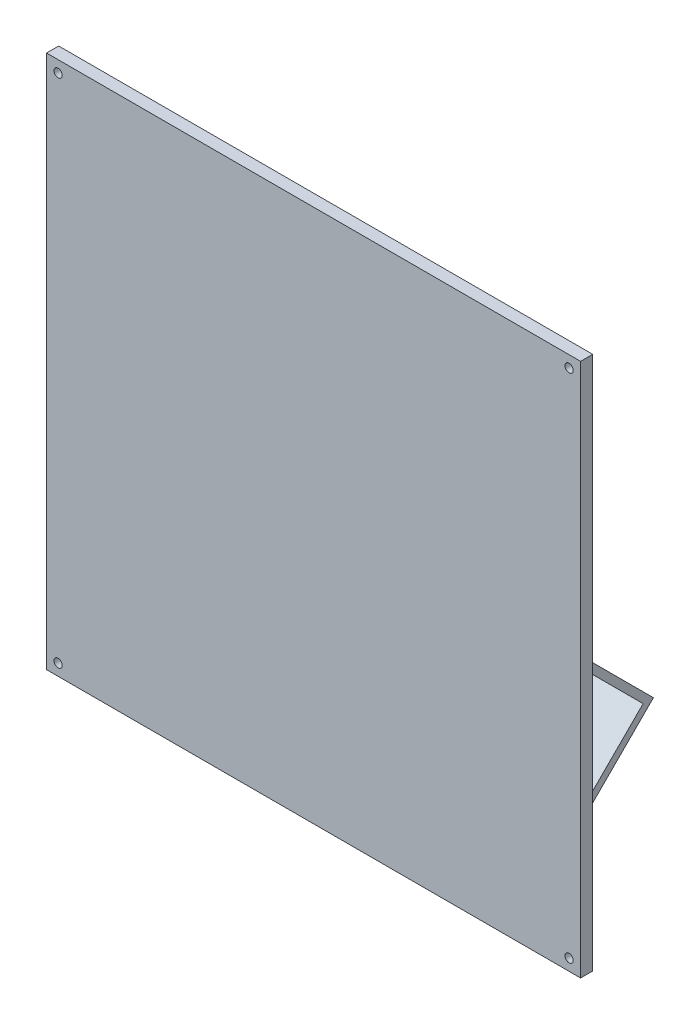
ISO-10303-21;
HEADER;
FILE_DESCRIPTION(('STEP AP214'),'2;1');
FILE_NAME('part.step','',(''),(''),'','','');
FILE_SCHEMA(('AUTOMOTIVE_DESIGN { 1 0 10303 214 1 1 1 1 }'));
ENDSEC;
DATA;
#1=APPLICATION_CONTEXT('core data for automotive mechanical design processes');
#2=APPLICATION_PROTOCOL_DEFINITION('international standard','automotive_design',2000,#1);
#3=PRODUCT_CONTEXT('',#1,'mechanical');
#4=PRODUCT('Part','Part','',(#3));
#5=PRODUCT_RELATED_PRODUCT_CATEGORY('part','',(#4));
#6=PRODUCT_DEFINITION_FORMATION('','',#4);
#7=PRODUCT_DEFINITION_CONTEXT('part definition',#1,'design');
#8=PRODUCT_DEFINITION('design','',#6,#7);
#9=PRODUCT_DEFINITION_SHAPE('','',#8);
#10=(LENGTH_UNIT() NAMED_UNIT(*) SI_UNIT(.MILLI.,.METRE.));
#11=(NAMED_UNIT(*) PLANE_ANGLE_UNIT() SI_UNIT($,.RADIAN.));
#12=(NAMED_UNIT(*) SI_UNIT($,.STERADIAN.) SOLID_ANGLE_UNIT());
#13=UNCERTAINTY_MEASURE_WITH_UNIT(LENGTH_MEASURE(1.E-05),#10,'distance_accuracy_value','');
#14=(GEOMETRIC_REPRESENTATION_CONTEXT(3) GLOBAL_UNCERTAINTY_ASSIGNED_CONTEXT((#13)) GLOBAL_UNIT_ASSIGNED_CONTEXT((#10,
#11,#12)) REPRESENTATION_CONTEXT('',''));
#15=CARTESIAN_POINT('',(0.,0.,0.));
#16=DIRECTION('',(0.,0.,1.));
#17=DIRECTION('',(1.,0.,0.));
#18=AXIS2_PLACEMENT_3D('',#15,#16,#17);
#19=CARTESIAN_POINT('',(0.,0.,0.));
#20=DIRECTION('',(0.,0.,-1.));
#21=DIRECTION('',(-1.,0.,0.));
#22=AXIS2_PLACEMENT_3D('',#19,#20,#21);
#23=PLANE('',#22);
#24=DIRECTION('',(1.,0.,0.));
#25=VECTOR('',#24,1.);
#26=CARTESIAN_POINT('',(0.,-105.757294357316,0.));
#27=LINE('',#26,#25);
#28=CARTESIAN_POINT('',(-80.,-105.757294357316,0.));
#29=VERTEX_POINT('',#28);
#30=CARTESIAN_POINT('',(80.,-105.757294357316,0.));
#31=VERTEX_POINT('',#30);
#32=EDGE_CURVE('E133',#29,#31,#27,.T.);
#33=ORIENTED_EDGE('',*,*,#32,.F.);
#34=DIRECTION('',(0.,1.,0.));
#35=VECTOR('',#34,1.);
#36=CARTESIAN_POINT('',(-80.,0.,0.));
#37=LINE('',#36,#35);
#38=CARTESIAN_POINT('',(-80.,-109.999935044435,0.));
#39=VERTEX_POINT('',#38);
#40=EDGE_CURVE('E116',#39,#29,#37,.T.);
#41=ORIENTED_EDGE('',*,*,#40,.F.);
#42=DIRECTION('',(1.,0.,0.));
#43=VECTOR('',#42,1.);
#44=CARTESIAN_POINT('',(0.,-109.999935044435,0.));
#45=LINE('',#44,#43);
#46=CARTESIAN_POINT('',(80.,-109.999935044435,0.));
#47=VERTEX_POINT('',#46);
#48=EDGE_CURVE('E125',#39,#47,#45,.T.);
#49=ORIENTED_EDGE('',*,*,#48,.T.);
#50=DIRECTION('',(0.,-1.,0.));
#51=VECTOR('',#50,1.);
#52=CARTESIAN_POINT('',(80.,0.,0.));
#53=LINE('',#52,#51);
#54=EDGE_CURVE('E135',#31,#47,#53,.T.);
#55=ORIENTED_EDGE('',*,*,#54,.F.);
#56=EDGE_LOOP('',(#33,#41,#49,#55));
#57=FACE_BOUND('',#56,.T.);
#58=CARTESIAN_POINT('',(-105.25,105.25,0.));
#59=DIRECTION('',(0.,0.,-1.));
#60=DIRECTION('',(-1.,0.,0.));
#61=AXIS2_PLACEMENT_3D('',#58,#59,#60);
#62=CIRCLE('',#61,3.15);
#63=CARTESIAN_POINT('',(-108.4,105.25,0.));
#64=VERTEX_POINT('',#63);
#65=EDGE_CURVE('E122',#64,#64,#62,.T.);
#66=ORIENTED_EDGE('',*,*,#65,.F.);
#67=EDGE_LOOP('',(#66));
#68=FACE_BOUND('',#67,.T.);
#69=CARTESIAN_POINT('',(105.25,105.25,0.));
#70=DIRECTION('',(0.,0.,-1.));
#71=DIRECTION('',(-1.,0.,0.));
#72=AXIS2_PLACEMENT_3D('',#69,#70,#71);
#73=CIRCLE('',#72,3.15);
#74=CARTESIAN_POINT('',(102.1,105.25,0.));
#75=VERTEX_POINT('',#74);
#76=EDGE_CURVE('E159',#75,#75,#73,.T.);
#77=ORIENTED_EDGE('',*,*,#76,.F.);
#78=EDGE_LOOP('',(#77));
#79=FACE_BOUND('',#78,.T.);
#80=CARTESIAN_POINT('',(-105.25,-105.25,0.));
#81=DIRECTION('',(0.,0.,-1.));
#82=DIRECTION('',(-1.,0.,0.));
#83=AXIS2_PLACEMENT_3D('',#80,#81,#82);
#84=CIRCLE('',#83,3.15);
#85=CARTESIAN_POINT('',(-108.4,-105.25,0.));
#86=VERTEX_POINT('',#85);
#87=EDGE_CURVE('E168',#86,#86,#84,.T.);
#88=ORIENTED_EDGE('',*,*,#87,.F.);
#89=EDGE_LOOP('',(#88));
#90=FACE_BOUND('',#89,.T.);
#91=CARTESIAN_POINT('',(105.25,-105.25,0.));
#92=DIRECTION('',(0.,0.,-1.));
#93=DIRECTION('',(-1.,0.,0.));
#94=AXIS2_PLACEMENT_3D('',#91,#92,#93);
#95=CIRCLE('',#94,3.15);
#96=CARTESIAN_POINT('',(102.1,-105.25,0.));
#97=VERTEX_POINT('',#96);
#98=EDGE_CURVE('E177',#97,#97,#95,.T.);
#99=ORIENTED_EDGE('',*,*,#98,.F.);
#100=EDGE_LOOP('',(#99));
#101=FACE_BOUND('',#100,.T.);
#102=DIRECTION('',(0.,1.,0.));
#103=VECTOR('',#102,1.);
#104=CARTESIAN_POINT('',(110.,-110.,0.));
#105=LINE('',#104,#103);
#106=CARTESIAN_POINT('',(110.,-110.,0.));
#107=VERTEX_POINT('',#106);
#108=CARTESIAN_POINT('',(110.,110.,0.));
#109=VERTEX_POINT('',#108);
#110=EDGE_CURVE('E186',#107,#109,#105,.T.);
#111=ORIENTED_EDGE('',*,*,#110,.F.);
#112=DIRECTION('',(1.,0.,0.));
#113=VECTOR('',#112,1.);
#114=CARTESIAN_POINT('',(-110.,-110.,0.));
#115=LINE('',#114,#113);
#116=CARTESIAN_POINT('',(-110.,-110.,0.));
#117=VERTEX_POINT('',#116);
#118=EDGE_CURVE('E191',#117,#107,#115,.T.);
#119=ORIENTED_EDGE('',*,*,#118,.F.);
#120=DIRECTION('',(0.,-1.,0.));
#121=VECTOR('',#120,1.);
#122=CARTESIAN_POINT('',(-110.,-110.,0.));
#123=LINE('',#122,#121);
#124=CARTESIAN_POINT('',(-110.,110.,0.));
#125=VERTEX_POINT('',#124);
#126=EDGE_CURVE('E202',#125,#117,#123,.T.);
#127=ORIENTED_EDGE('',*,*,#126,.F.);
#128=DIRECTION('',(-1.,0.,0.));
#129=VECTOR('',#128,1.);
#130=CARTESIAN_POINT('',(-110.,110.,0.));
#131=LINE('',#130,#129);
#132=EDGE_CURVE('E200',#109,#125,#131,.T.);
#133=ORIENTED_EDGE('',*,*,#132,.F.);
#134=EDGE_LOOP('',(#111,#119,#127,#133));
#135=FACE_BOUND('',#134,.T.);
#136=DIRECTION('',(1.,0.,0.));
#137=VECTOR('',#136,1.);
#138=CARTESIAN_POINT('',(0.,-4.24264068711931,0.));
#139=LINE('',#138,#137);
#140=CARTESIAN_POINT('',(-80.,-4.24264068711931,0.));
#141=VERTEX_POINT('',#140);
#142=CARTESIAN_POINT('',(80.,-4.24264068711931,0.));
#143=VERTEX_POINT('',#142);
#144=EDGE_CURVE('E43',#141,#143,#139,.T.);
#145=ORIENTED_EDGE('',*,*,#144,.T.);
#146=DIRECTION('',(0.,1.,0.));
#147=VECTOR('',#146,1.);
#148=CARTESIAN_POINT('',(80.,0.,0.));
#149=LINE('',#148,#147);
#150=CARTESIAN_POINT('',(80.,0.,0.));
#151=VERTEX_POINT('',#150);
#152=EDGE_CURVE('E11',#143,#151,#149,.T.);
#153=ORIENTED_EDGE('',*,*,#152,.T.);
#154=DIRECTION('',(-1.,0.,0.));
#155=VECTOR('',#154,1.);
#156=CARTESIAN_POINT('',(80.,0.,0.));
#157=LINE('',#156,#155);
#158=CARTESIAN_POINT('',(-80.,0.,0.));
#159=VERTEX_POINT('',#158);
#160=EDGE_CURVE('E137',#151,#159,#157,.T.);
#161=ORIENTED_EDGE('',*,*,#160,.T.);
#162=DIRECTION('',(0.,-1.,0.));
#163=VECTOR('',#162,1.);
#164=CARTESIAN_POINT('',(-80.,0.,0.));
#165=LINE('',#164,#163);
#166=EDGE_CURVE('E216',#159,#141,#165,.T.);
#167=ORIENTED_EDGE('',*,*,#166,.T.);
#168=EDGE_LOOP('',(#145,#153,#161,#167));
#169=FACE_BOUND('',#168,.T.);
#170=ADVANCED_FACE('F35',(#57,#68,#79,#90,#101,#135,#169),#23,.T.);
#171=CARTESIAN_POINT('',(110.,-110.,5.));
#172=DIRECTION('',(-1.,0.,0.));
#173=DIRECTION('',(0.,0.,1.));
#174=AXIS2_PLACEMENT_3D('',#171,#172,#173);
#175=PLANE('',#174);
#176=ORIENTED_EDGE('',*,*,#110,.T.);
#177=DIRECTION('',(0.,0.,-1.));
#178=VECTOR('',#177,1.);
#179=CARTESIAN_POINT('',(110.,110.,5.));
#180=LINE('',#179,#178);
#181=CARTESIAN_POINT('',(110.,110.,5.));
#182=VERTEX_POINT('',#181);
#183=EDGE_CURVE('E213',#182,#109,#180,.T.);
#184=ORIENTED_EDGE('',*,*,#183,.F.);
#185=DIRECTION('',(0.,1.,0.));
#186=VECTOR('',#185,1.);
#187=CARTESIAN_POINT('',(110.,-110.,5.));
#188=LINE('',#187,#186);
#189=CARTESIAN_POINT('',(110.,-110.,5.));
#190=VERTEX_POINT('',#189);
#191=EDGE_CURVE('E187',#190,#182,#188,.T.);
#192=ORIENTED_EDGE('',*,*,#191,.F.);
#193=DIRECTION('',(0.,0.,-1.));
#194=VECTOR('',#193,1.);
#195=CARTESIAN_POINT('',(110.,-110.,5.));
#196=LINE('',#195,#194);
#197=EDGE_CURVE('E197',#190,#107,#196,.T.);
#198=ORIENTED_EDGE('',*,*,#197,.T.);
#199=EDGE_LOOP('',(#176,#184,#192,#198));
#200=FACE_BOUND('',#199,.T.);
#201=ADVANCED_FACE('F37',(#200),#175,.F.);
#202=CARTESIAN_POINT('',(-110.,110.,5.));
#203=DIRECTION('',(0.,-1.,0.));
#204=DIRECTION('',(0.,0.,-1.));
#205=AXIS2_PLACEMENT_3D('',#202,#203,#204);
#206=PLANE('',#205);
#207=ORIENTED_EDGE('',*,*,#132,.T.);
#208=DIRECTION('',(0.,0.,-1.));
#209=VECTOR('',#208,1.);
#210=CARTESIAN_POINT('',(-110.,110.,5.));
#211=LINE('',#210,#209);
#212=CARTESIAN_POINT('',(-110.,110.,5.));
#213=VERTEX_POINT('',#212);
#214=EDGE_CURVE('E210',#213,#125,#211,.T.);
#215=ORIENTED_EDGE('',*,*,#214,.F.);
#216=DIRECTION('',(-1.,0.,0.));
#217=VECTOR('',#216,1.);
#218=CARTESIAN_POINT('',(-110.,110.,5.));
#219=LINE('',#218,#217);
#220=EDGE_CURVE('E190',#182,#213,#219,.T.);
#221=ORIENTED_EDGE('',*,*,#220,.F.);
#222=ORIENTED_EDGE('',*,*,#183,.T.);
#223=EDGE_LOOP('',(#207,#215,#221,#222));
#224=FACE_BOUND('',#223,.T.);
#225=ADVANCED_FACE('F251',(#224),#206,.F.);
#226=CARTESIAN_POINT('',(-110.,-110.,5.));
#227=DIRECTION('',(1.,0.,0.));
#228=DIRECTION('',(0.,0.,-1.));
#229=AXIS2_PLACEMENT_3D('',#226,#227,#228);
#230=PLANE('',#229);
#231=ORIENTED_EDGE('',*,*,#126,.T.);
#232=DIRECTION('',(0.,0.,-1.));
#233=VECTOR('',#232,1.);
#234=CARTESIAN_POINT('',(-110.,-110.,5.));
#235=LINE('',#234,#233);
#236=CARTESIAN_POINT('',(-110.,-110.,5.));
#237=VERTEX_POINT('',#236);
#238=EDGE_CURVE('E207',#237,#117,#235,.T.);
#239=ORIENTED_EDGE('',*,*,#238,.F.);
#240=DIRECTION('',(0.,-1.,0.));
#241=VECTOR('',#240,1.);
#242=CARTESIAN_POINT('',(-110.,-110.,5.));
#243=LINE('',#242,#241);
#244=EDGE_CURVE('E193',#213,#237,#243,.T.);
#245=ORIENTED_EDGE('',*,*,#244,.F.);
#246=ORIENTED_EDGE('',*,*,#214,.T.);
#247=EDGE_LOOP('',(#231,#239,#245,#246));
#248=FACE_BOUND('',#247,.T.);
#249=ADVANCED_FACE('F260',(#248),#230,.F.);
#250=CARTESIAN_POINT('',(-110.,-110.,5.));
#251=DIRECTION('',(0.,1.,0.));
#252=DIRECTION('',(0.,0.,1.));
#253=AXIS2_PLACEMENT_3D('',#250,#251,#252);
#254=PLANE('',#253);
#255=ORIENTED_EDGE('',*,*,#118,.T.);
#256=ORIENTED_EDGE('',*,*,#197,.F.);
#257=DIRECTION('',(1.,0.,0.));
#258=VECTOR('',#257,1.);
#259=CARTESIAN_POINT('',(-110.,-110.,5.));
#260=LINE('',#259,#258);
#261=EDGE_CURVE('E195',#237,#190,#260,.T.);
#262=ORIENTED_EDGE('',*,*,#261,.F.);
#263=ORIENTED_EDGE('',*,*,#238,.T.);
#264=EDGE_LOOP('',(#255,#256,#262,#263));
#265=FACE_BOUND('',#264,.T.);
#266=ADVANCED_FACE('F257',(#265),#254,.F.);
#267=CARTESIAN_POINT('',(0.,0.,5.));
#268=DIRECTION('',(0.,0.,-1.));
#269=DIRECTION('',(-1.,0.,0.));
#270=AXIS2_PLACEMENT_3D('',#267,#268,#269);
#271=PLANE('',#270);
#272=CARTESIAN_POINT('',(-105.25,105.25,5.));
#273=DIRECTION('',(0.,0.,-1.));
#274=DIRECTION('',(-1.,0.,0.));
#275=AXIS2_PLACEMENT_3D('',#272,#273,#274);
#276=CIRCLE('',#275,1.69999999999999);
#277=CARTESIAN_POINT('',(-106.95,105.25,5.));
#278=VERTEX_POINT('',#277);
#279=EDGE_CURVE('E156',#278,#278,#276,.T.);
#280=ORIENTED_EDGE('',*,*,#279,.T.);
#281=EDGE_LOOP('',(#280));
#282=FACE_BOUND('',#281,.T.);
#283=CARTESIAN_POINT('',(105.25,105.25,5.));
#284=DIRECTION('',(0.,0.,-1.));
#285=DIRECTION('',(-1.,0.,0.));
#286=AXIS2_PLACEMENT_3D('',#283,#284,#285);
#287=CIRCLE('',#286,1.69999999999999);
#288=CARTESIAN_POINT('',(103.55,105.25,5.));
#289=VERTEX_POINT('',#288);
#290=EDGE_CURVE('E165',#289,#289,#287,.T.);
#291=ORIENTED_EDGE('',*,*,#290,.T.);
#292=EDGE_LOOP('',(#291));
#293=FACE_BOUND('',#292,.T.);
#294=CARTESIAN_POINT('',(-105.25,-105.25,5.));
#295=DIRECTION('',(0.,0.,-1.));
#296=DIRECTION('',(-1.,0.,0.));
#297=AXIS2_PLACEMENT_3D('',#294,#295,#296);
#298=CIRCLE('',#297,1.69999999999999);
#299=CARTESIAN_POINT('',(-106.95,-105.25,5.));
#300=VERTEX_POINT('',#299);
#301=EDGE_CURVE('E174',#300,#300,#298,.T.);
#302=ORIENTED_EDGE('',*,*,#301,.T.);
#303=EDGE_LOOP('',(#302));
#304=FACE_BOUND('',#303,.T.);
#305=CARTESIAN_POINT('',(105.25,-105.25,5.));
#306=DIRECTION('',(0.,0.,-1.));
#307=DIRECTION('',(-1.,0.,0.));
#308=AXIS2_PLACEMENT_3D('',#305,#306,#307);
#309=CIRCLE('',#308,1.69999999999999);
#310=CARTESIAN_POINT('',(103.55,-105.25,5.));
#311=VERTEX_POINT('',#310);
#312=EDGE_CURVE('E183',#311,#311,#309,.T.);
#313=ORIENTED_EDGE('',*,*,#312,.T.);
#314=EDGE_LOOP('',(#313));
#315=FACE_BOUND('',#314,.T.);
#316=ORIENTED_EDGE('',*,*,#191,.T.);
#317=ORIENTED_EDGE('',*,*,#220,.T.);
#318=ORIENTED_EDGE('',*,*,#244,.T.);
#319=ORIENTED_EDGE('',*,*,#261,.T.);
#320=EDGE_LOOP('',(#316,#317,#318,#319));
#321=FACE_BOUND('',#320,.T.);
#322=ADVANCED_FACE('F255',(#282,#293,#304,#315,#321),#271,.F.);
#323=CARTESIAN_POINT('',(105.25,-105.25,0.));
#324=DIRECTION('',(0.,0.,-1.));
#325=DIRECTION('',(-1.,0.,0.));
#326=AXIS2_PLACEMENT_3D('',#323,#324,#325);
#327=CYLINDRICAL_SURFACE('',#326,1.69999999999999);
#328=ORIENTED_EDGE('',*,*,#312,.F.);
#329=EDGE_LOOP('',(#328));
#330=FACE_BOUND('',#329,.T.);
#331=CARTESIAN_POINT('',(105.25,-105.25,1.45));
#332=DIRECTION('',(0.,0.,-1.));
#333=DIRECTION('',(-1.,0.,0.));
#334=AXIS2_PLACEMENT_3D('',#331,#332,#333);
#335=CIRCLE('',#334,1.69999999999999);
#336=CARTESIAN_POINT('',(103.55,-105.25,1.45));
#337=VERTEX_POINT('',#336);
#338=EDGE_CURVE('E180',#337,#337,#335,.T.);
#339=ORIENTED_EDGE('',*,*,#338,.T.);
#340=EDGE_LOOP('',(#339));
#341=FACE_BOUND('',#340,.T.);
#342=ADVANCED_FACE('F281',(#330,#341),#327,.F.);
#343=CARTESIAN_POINT('',(105.25,-105.25,0.));
#344=DIRECTION('',(0.,0.,-1.));
#345=DIRECTION('',(-1.,0.,0.));
#346=AXIS2_PLACEMENT_3D('',#343,#344,#345);
#347=CONICAL_SURFACE('',#346,3.15,0.785398163397451);
#348=ORIENTED_EDGE('',*,*,#338,.F.);
#349=EDGE_LOOP('',(#348));
#350=FACE_BOUND('',#349,.T.);
#351=ORIENTED_EDGE('',*,*,#98,.T.);
#352=EDGE_LOOP('',(#351));
#353=FACE_BOUND('',#352,.T.);
#354=ADVANCED_FACE('F286',(#350,#353),#347,.F.);
#355=CARTESIAN_POINT('',(-105.25,-105.25,0.));
#356=DIRECTION('',(0.,0.,-1.));
#357=DIRECTION('',(-1.,0.,0.));
#358=AXIS2_PLACEMENT_3D('',#355,#356,#357);
#359=CYLINDRICAL_SURFACE('',#358,1.69999999999999);
#360=ORIENTED_EDGE('',*,*,#301,.F.);
#361=EDGE_LOOP('',(#360));
#362=FACE_BOUND('',#361,.T.);
#363=CARTESIAN_POINT('',(-105.25,-105.25,1.45));
#364=DIRECTION('',(0.,0.,-1.));
#365=DIRECTION('',(-1.,0.,0.));
#366=AXIS2_PLACEMENT_3D('',#363,#364,#365);
#367=CIRCLE('',#366,1.69999999999999);
#368=CARTESIAN_POINT('',(-106.95,-105.25,1.45));
#369=VERTEX_POINT('',#368);
#370=EDGE_CURVE('E171',#369,#369,#367,.T.);
#371=ORIENTED_EDGE('',*,*,#370,.T.);
#372=EDGE_LOOP('',(#371));
#373=FACE_BOUND('',#372,.T.);
#374=ADVANCED_FACE('F300',(#362,#373),#359,.F.);
#375=CARTESIAN_POINT('',(-105.25,-105.25,0.));
#376=DIRECTION('',(0.,0.,-1.));
#377=DIRECTION('',(-1.,0.,0.));
#378=AXIS2_PLACEMENT_3D('',#375,#376,#377);
#379=CONICAL_SURFACE('',#378,3.15,0.785398163397451);
#380=ORIENTED_EDGE('',*,*,#370,.F.);
#381=EDGE_LOOP('',(#380));
#382=FACE_BOUND('',#381,.T.);
#383=ORIENTED_EDGE('',*,*,#87,.T.);
#384=EDGE_LOOP('',(#383));
#385=FACE_BOUND('',#384,.T.);
#386=ADVANCED_FACE('F307',(#382,#385),#379,.F.);
#387=CARTESIAN_POINT('',(105.25,105.25,0.));
#388=DIRECTION('',(0.,0.,-1.));
#389=DIRECTION('',(-1.,0.,0.));
#390=AXIS2_PLACEMENT_3D('',#387,#388,#389);
#391=CYLINDRICAL_SURFACE('',#390,1.69999999999999);
#392=ORIENTED_EDGE('',*,*,#290,.F.);
#393=EDGE_LOOP('',(#392));
#394=FACE_BOUND('',#393,.T.);
#395=CARTESIAN_POINT('',(105.25,105.25,1.45));
#396=DIRECTION('',(0.,0.,-1.));
#397=DIRECTION('',(-1.,0.,0.));
#398=AXIS2_PLACEMENT_3D('',#395,#396,#397);
#399=CIRCLE('',#398,1.69999999999999);
#400=CARTESIAN_POINT('',(103.55,105.25,1.45));
#401=VERTEX_POINT('',#400);
#402=EDGE_CURVE('E162',#401,#401,#399,.T.);
#403=ORIENTED_EDGE('',*,*,#402,.T.);
#404=EDGE_LOOP('',(#403));
#405=FACE_BOUND('',#404,.T.);
#406=ADVANCED_FACE('F313',(#394,#405),#391,.F.);
#407=CARTESIAN_POINT('',(105.25,105.25,0.));
#408=DIRECTION('',(0.,0.,-1.));
#409=DIRECTION('',(-1.,0.,0.));
#410=AXIS2_PLACEMENT_3D('',#407,#408,#409);
#411=CONICAL_SURFACE('',#410,3.15,0.785398163397451);
#412=ORIENTED_EDGE('',*,*,#402,.F.);
#413=EDGE_LOOP('',(#412));
#414=FACE_BOUND('',#413,.T.);
#415=ORIENTED_EDGE('',*,*,#76,.T.);
#416=EDGE_LOOP('',(#415));
#417=FACE_BOUND('',#416,.T.);
#418=ADVANCED_FACE('F317',(#414,#417),#411,.F.);
#419=CARTESIAN_POINT('',(-105.25,105.25,0.));
#420=DIRECTION('',(0.,0.,-1.));
#421=DIRECTION('',(-1.,0.,0.));
#422=AXIS2_PLACEMENT_3D('',#419,#420,#421);
#423=CYLINDRICAL_SURFACE('',#422,1.69999999999999);
#424=ORIENTED_EDGE('',*,*,#279,.F.);
#425=EDGE_LOOP('',(#424));
#426=FACE_BOUND('',#425,.T.);
#427=CARTESIAN_POINT('',(-105.25,105.25,1.45));
#428=DIRECTION('',(0.,0.,-1.));
#429=DIRECTION('',(-1.,0.,0.));
#430=AXIS2_PLACEMENT_3D('',#427,#428,#429);
#431=CIRCLE('',#430,1.69999999999999);
#432=CARTESIAN_POINT('',(-106.95,105.25,1.45));
#433=VERTEX_POINT('',#432);
#434=EDGE_CURVE('E153',#433,#433,#431,.T.);
#435=ORIENTED_EDGE('',*,*,#434,.T.);
#436=EDGE_LOOP('',(#435));
#437=FACE_BOUND('',#436,.T.);
#438=ADVANCED_FACE('F321',(#426,#437),#423,.F.);
#439=CARTESIAN_POINT('',(-105.25,105.25,0.));
#440=DIRECTION('',(0.,0.,-1.));
#441=DIRECTION('',(-1.,0.,0.));
#442=AXIS2_PLACEMENT_3D('',#439,#440,#441);
#443=CONICAL_SURFACE('',#442,3.15,0.785398163397451);
#444=ORIENTED_EDGE('',*,*,#434,.F.);
#445=EDGE_LOOP('',(#444));
#446=FACE_BOUND('',#445,.T.);
#447=ORIENTED_EDGE('',*,*,#65,.T.);
#448=EDGE_LOOP('',(#447));
#449=FACE_BOUND('',#448,.T.);
#450=ADVANCED_FACE('F325',(#446,#449),#443,.F.);
#451=CARTESIAN_POINT('',(80.,-2.12132034355963,2.12132034355965));
#452=DIRECTION('',(-1.,0.,0.));
#453=DIRECTION('',(0.,0.,1.));
#454=AXIS2_PLACEMENT_3D('',#451,#452,#453);
#455=PLANE('',#454);
#456=DIRECTION('',(0.,0.707106781186551,0.707106781186544));
#457=VECTOR('',#456,1.);
#458=CARTESIAN_POINT('',(80.,-2.12132034355963,2.12132034355965));
#459=LINE('',#458,#457);
#460=CARTESIAN_POINT('',(80.,-54.999967522218,-50.7573268350981));
#461=VERTEX_POINT('',#460);
#462=EDGE_CURVE('E142',#461,#143,#459,.T.);
#463=ORIENTED_EDGE('',*,*,#462,.F.);
#464=DIRECTION('',(0.,-0.707106781186544,0.707106781186551));
#465=VECTOR('',#464,1.);
#466=CARTESIAN_POINT('',(80.,-52.8786471786583,-52.8786471786577));
#467=LINE('',#466,#465);
#468=EDGE_CURVE('E129',#461,#31,#467,.T.);
#469=ORIENTED_EDGE('',*,*,#468,.T.);
#470=ORIENTED_EDGE('',*,*,#54,.T.);
#471=DIRECTION('',(0.,0.707106781186544,-0.707106781186551));
#472=VECTOR('',#471,1.);
#473=CARTESIAN_POINT('',(80.,-57.1212878657776,-52.8786471786577));
#474=LINE('',#473,#472);
#475=CARTESIAN_POINT('',(80.,-54.999967522218,-54.9999675222174));
#476=VERTEX_POINT('',#475);
#477=EDGE_CURVE('E50',#47,#476,#474,.T.);
#478=ORIENTED_EDGE('',*,*,#477,.T.);
#479=DIRECTION('',(0.,0.707106781186551,0.707106781186544));
#480=VECTOR('',#479,1.);
#481=CARTESIAN_POINT('',(80.,0.,0.));
#482=LINE('',#481,#480);
#483=EDGE_CURVE('E134',#476,#151,#482,.T.);
#484=ORIENTED_EDGE('',*,*,#483,.T.);
#485=ORIENTED_EDGE('',*,*,#152,.F.);
#486=EDGE_LOOP('',(#463,#469,#470,#478,#484,#485));
#487=FACE_BOUND('',#486,.T.);
#488=ADVANCED_FACE('F224',(#487),#455,.F.);
#489=CARTESIAN_POINT('',(-80.,-2.12132034355963,2.12132034355965));
#490=DIRECTION('',(1.,0.,0.));
#491=DIRECTION('',(0.,0.,-1.));
#492=AXIS2_PLACEMENT_3D('',#489,#490,#491);
#493=PLANE('',#492);
#494=DIRECTION('',(0.,-0.707106781186551,-0.707106781186544));
#495=VECTOR('',#494,1.);
#496=CARTESIAN_POINT('',(-80.,0.,0.));
#497=LINE('',#496,#495);
#498=CARTESIAN_POINT('',(-80.,-54.999967522218,-54.9999675222174));
#499=VERTEX_POINT('',#498);
#500=EDGE_CURVE('E120',#159,#499,#497,.T.);
#501=ORIENTED_EDGE('',*,*,#500,.T.);
#502=DIRECTION('',(0.,0.707106781186544,-0.707106781186551));
#503=VECTOR('',#502,1.);
#504=CARTESIAN_POINT('',(-80.,-57.1212878657776,-52.8786471786577));
#505=LINE('',#504,#503);
#506=EDGE_CURVE('E112',#39,#499,#505,.T.);
#507=ORIENTED_EDGE('',*,*,#506,.F.);
#508=ORIENTED_EDGE('',*,*,#40,.T.);
#509=DIRECTION('',(0.,0.707106781186544,-0.707106781186551));
#510=VECTOR('',#509,1.);
#511=CARTESIAN_POINT('',(-80.,-52.8786471786583,-52.8786471786577));
#512=LINE('',#511,#510);
#513=CARTESIAN_POINT('',(-80.,-54.999967522218,-50.7573268350981));
#514=VERTEX_POINT('',#513);
#515=EDGE_CURVE('E230',#29,#514,#512,.T.);
#516=ORIENTED_EDGE('',*,*,#515,.T.);
#517=DIRECTION('',(0.,-0.707106781186551,-0.707106781186544));
#518=VECTOR('',#517,1.);
#519=CARTESIAN_POINT('',(-80.,-2.12132034355963,2.12132034355965));
#520=LINE('',#519,#518);
#521=EDGE_CURVE('E144',#141,#514,#520,.T.);
#522=ORIENTED_EDGE('',*,*,#521,.F.);
#523=ORIENTED_EDGE('',*,*,#166,.F.);
#524=EDGE_LOOP('',(#501,#507,#508,#516,#522,#523));
#525=FACE_BOUND('',#524,.T.);
#526=ADVANCED_FACE('F113',(#525),#493,.F.);
#527=CARTESIAN_POINT('',(80.,-57.1212878657776,-52.8786471786577));
#528=DIRECTION('',(0.,0.707106781186551,0.707106781186544));
#529=DIRECTION('',(0.,-0.707106781186544,0.707106781186551));
#530=AXIS2_PLACEMENT_3D('',#527,#528,#529);
#531=PLANE('',#530);
#532=DIRECTION('',(1.,0.,0.));
#533=VECTOR('',#532,1.);
#534=CARTESIAN_POINT('',(80.,-54.999967522218,-54.9999675222174));
#535=LINE('',#534,#533);
#536=EDGE_CURVE('E145',#499,#476,#535,.T.);
#537=ORIENTED_EDGE('',*,*,#536,.T.);
#538=ORIENTED_EDGE('',*,*,#477,.F.);
#539=ORIENTED_EDGE('',*,*,#48,.F.);
#540=ORIENTED_EDGE('',*,*,#506,.T.);
#541=EDGE_LOOP('',(#537,#538,#539,#540));
#542=FACE_BOUND('',#541,.T.);
#543=ADVANCED_FACE('F126',(#542),#531,.F.);
#544=CARTESIAN_POINT('',(0.,-2.12132034355963,2.12132034355965));
#545=DIRECTION('',(0.,0.707106781186544,-0.707106781186551));
#546=DIRECTION('',(0.,0.707106781186551,0.707106781186544));
#547=AXIS2_PLACEMENT_3D('',#544,#545,#546);
#548=PLANE('',#547);
#549=ORIENTED_EDGE('',*,*,#521,.T.);
#550=DIRECTION('',(1.,0.,0.));
#551=VECTOR('',#550,1.);
#552=CARTESIAN_POINT('',(0.,-54.999967522218,-50.7573268350981));
#553=LINE('',#552,#551);
#554=EDGE_CURVE('E58',#514,#461,#553,.T.);
#555=ORIENTED_EDGE('',*,*,#554,.T.);
#556=ORIENTED_EDGE('',*,*,#462,.T.);
#557=ORIENTED_EDGE('',*,*,#144,.F.);
#558=EDGE_LOOP('',(#549,#555,#556,#557));
#559=FACE_BOUND('',#558,.T.);
#560=ADVANCED_FACE('F231',(#559),#548,.F.);
#561=CARTESIAN_POINT('',(0.,0.,0.));
#562=DIRECTION('',(0.,0.707106781186544,-0.707106781186551));
#563=DIRECTION('',(0.,0.707106781186551,0.707106781186544));
#564=AXIS2_PLACEMENT_3D('',#561,#562,#563);
#565=PLANE('',#564);
#566=ORIENTED_EDGE('',*,*,#160,.F.);
#567=ORIENTED_EDGE('',*,*,#483,.F.);
#568=ORIENTED_EDGE('',*,*,#536,.F.);
#569=ORIENTED_EDGE('',*,*,#500,.F.);
#570=EDGE_LOOP('',(#566,#567,#568,#569));
#571=FACE_BOUND('',#570,.T.);
#572=ADVANCED_FACE('F229',(#571),#565,.T.);
#573=CARTESIAN_POINT('',(0.,-52.8786471786583,-52.8786471786578));
#574=DIRECTION('',(0.,0.707106781186551,0.707106781186544));
#575=DIRECTION('',(0.,-0.707106781186544,0.707106781186551));
#576=AXIS2_PLACEMENT_3D('',#573,#574,#575);
#577=PLANE('',#576);
#578=ORIENTED_EDGE('',*,*,#515,.F.);
#579=ORIENTED_EDGE('',*,*,#32,.T.);
#580=ORIENTED_EDGE('',*,*,#468,.F.);
#581=ORIENTED_EDGE('',*,*,#554,.F.);
#582=EDGE_LOOP('',(#578,#579,#580,#581));
#583=FACE_BOUND('',#582,.T.);
#584=ADVANCED_FACE('F233',(#583),#577,.T.);
#585=CLOSED_SHELL('',(#170,#201,#225,#249,#266,#322,#342,#354,#374,#386,#406,#418,#438,#450,
#488,#526,#543,#560,#572,#584));
#586=MANIFOLD_SOLID_BREP('B2',#585);
#587=ADVANCED_BREP_SHAPE_REPRESENTATION('',(#18,#586),#14);
#588=SHAPE_DEFINITION_REPRESENTATION(#9,#587);
ENDSEC;
END-ISO-10303-21;
